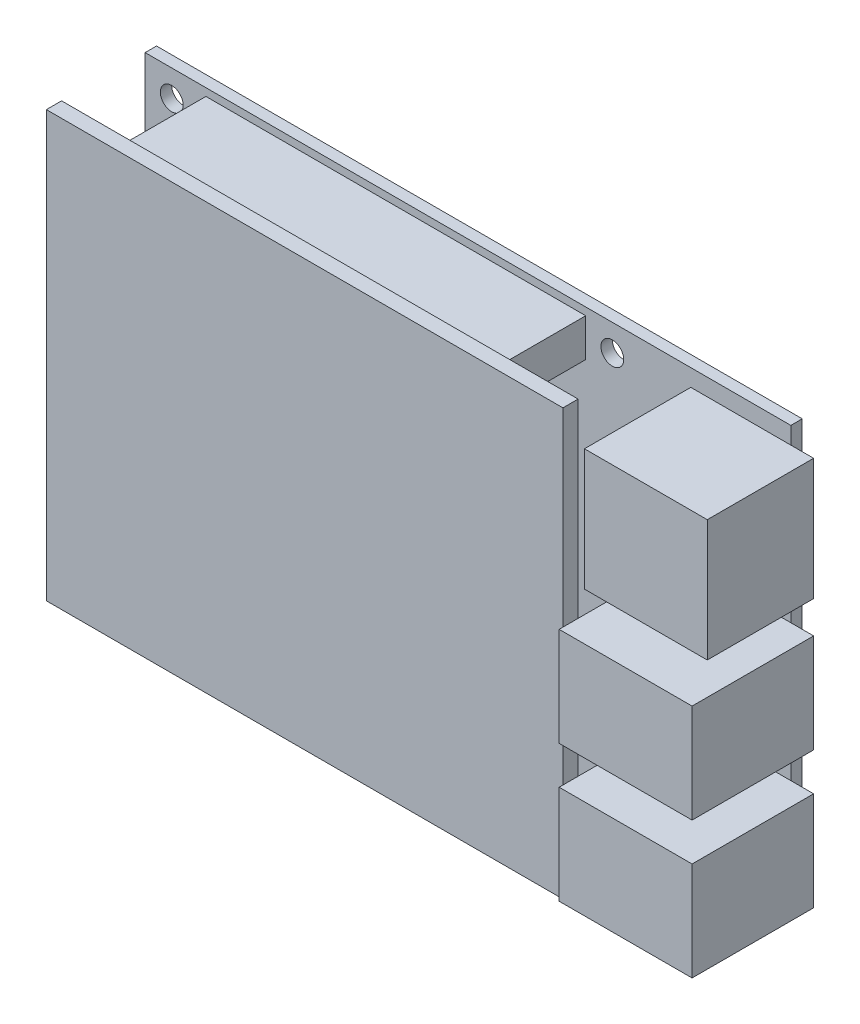
ISO-10303-21;
HEADER;
FILE_DESCRIPTION(('STEP AP214'),'2;1');
FILE_NAME('part.step','',(''),(''),'','','');
FILE_SCHEMA(('AUTOMOTIVE_DESIGN { 1 0 10303 214 1 1 1 1 }'));
ENDSEC;
DATA;
#1=APPLICATION_CONTEXT('core data for automotive mechanical design processes');
#2=APPLICATION_PROTOCOL_DEFINITION('international standard','automotive_design',2000,#1);
#3=PRODUCT_CONTEXT('',#1,'mechanical');
#4=PRODUCT('Part','Part','',(#3));
#5=PRODUCT_RELATED_PRODUCT_CATEGORY('part','',(#4));
#6=PRODUCT_DEFINITION_FORMATION('','',#4);
#7=PRODUCT_DEFINITION_CONTEXT('part definition',#1,'design');
#8=PRODUCT_DEFINITION('design','',#6,#7);
#9=PRODUCT_DEFINITION_SHAPE('','',#8);
#10=(LENGTH_UNIT() NAMED_UNIT(*) SI_UNIT(.MILLI.,.METRE.));
#11=(NAMED_UNIT(*) PLANE_ANGLE_UNIT() SI_UNIT($,.RADIAN.));
#12=(NAMED_UNIT(*) SI_UNIT($,.STERADIAN.) SOLID_ANGLE_UNIT());
#13=UNCERTAINTY_MEASURE_WITH_UNIT(LENGTH_MEASURE(1.E-05),#10,'distance_accuracy_value','');
#14=(GEOMETRIC_REPRESENTATION_CONTEXT(3) GLOBAL_UNCERTAINTY_ASSIGNED_CONTEXT((#13)) GLOBAL_UNIT_ASSIGNED_CONTEXT((#10,
#11,#12)) REPRESENTATION_CONTEXT('',''));
#15=CARTESIAN_POINT('',(0.,0.,0.));
#16=DIRECTION('',(0.,0.,1.));
#17=DIRECTION('',(1.,0.,0.));
#18=AXIS2_PLACEMENT_3D('',#15,#16,#17);
#19=CARTESIAN_POINT('',(0.,0.,1.5));
#20=DIRECTION('',(0.,0.,-1.));
#21=DIRECTION('',(-1.,0.,0.));
#22=AXIS2_PLACEMENT_3D('',#19,#20,#21);
#23=PLANE('',#22);
#24=DIRECTION('',(1.,0.,0.));
#25=VECTOR('',#24,1.);
#26=CARTESIAN_POINT('',(71.8313855418499,37.75,1.5));
#27=LINE('',#26,#25);
#28=CARTESIAN_POINT('',(71.8313855418499,37.75,1.5));
#29=VERTEX_POINT('',#28);
#30=CARTESIAN_POINT('',(85.,37.75,1.5));
#31=VERTEX_POINT('',#30);
#32=EDGE_CURVE('E318',#29,#31,#27,.T.);
#33=ORIENTED_EDGE('',*,*,#32,.F.);
#34=DIRECTION('',(0.,-1.,0.));
#35=VECTOR('',#34,1.);
#36=CARTESIAN_POINT('',(71.8313855418499,53.75,1.5));
#37=LINE('',#36,#35);
#38=CARTESIAN_POINT('',(71.8313855418499,53.75,1.5));
#39=VERTEX_POINT('',#38);
#40=EDGE_CURVE('E298',#39,#29,#37,.T.);
#41=ORIENTED_EDGE('',*,*,#40,.F.);
#42=DIRECTION('',(-1.,0.,0.));
#43=VECTOR('',#42,1.);
#44=CARTESIAN_POINT('',(71.8313855418499,53.75,1.5));
#45=LINE('',#44,#43);
#46=CARTESIAN_POINT('',(85.,53.75,1.5));
#47=VERTEX_POINT('',#46);
#48=EDGE_CURVE('E325',#47,#39,#45,.T.);
#49=ORIENTED_EDGE('',*,*,#48,.F.);
#50=DIRECTION('',(0.,1.,0.));
#51=VECTOR('',#50,1.);
#52=CARTESIAN_POINT('',(85.,0.,1.5));
#53=LINE('',#52,#51);
#54=CARTESIAN_POINT('',(85.,56.,1.5));
#55=VERTEX_POINT('',#54);
#56=EDGE_CURVE('E476',#47,#55,#53,.T.);
#57=ORIENTED_EDGE('',*,*,#56,.T.);
#58=DIRECTION('',(-1.,0.,0.));
#59=VECTOR('',#58,1.);
#60=CARTESIAN_POINT('',(0.,56.,1.5));
#61=LINE('',#60,#59);
#62=CARTESIAN_POINT('',(0.,56.,1.5));
#63=VERTEX_POINT('',#62);
#64=EDGE_CURVE('E481',#55,#63,#61,.T.);
#65=ORIENTED_EDGE('',*,*,#64,.T.);
#66=DIRECTION('',(0.,-1.,0.));
#67=VECTOR('',#66,1.);
#68=CARTESIAN_POINT('',(0.,0.,1.5));
#69=LINE('',#68,#67);
#70=CARTESIAN_POINT('',(0.,0.,1.5));
#71=VERTEX_POINT('',#70);
#72=EDGE_CURVE('E468',#63,#71,#69,.T.);
#73=ORIENTED_EDGE('',*,*,#72,.T.);
#74=DIRECTION('',(1.,0.,0.));
#75=VECTOR('',#74,1.);
#76=CARTESIAN_POINT('',(0.,0.,1.5));
#77=LINE('',#76,#75);
#78=CARTESIAN_POINT('',(85.,0.,1.5));
#79=VERTEX_POINT('',#78);
#80=EDGE_CURVE('E472',#71,#79,#77,.T.);
#81=ORIENTED_EDGE('',*,*,#80,.T.);
#82=CARTESIAN_POINT('',(85.,2.5,1.5));
#83=VERTEX_POINT('',#82);
#84=EDGE_CURVE('E477',#79,#83,#53,.T.);
#85=ORIENTED_EDGE('',*,*,#84,.T.);
#86=DIRECTION('',(1.,0.,0.));
#87=VECTOR('',#86,1.);
#88=CARTESIAN_POINT('',(88.,2.5,1.5));
#89=LINE('',#88,#87);
#90=CARTESIAN_POINT('',(70.5,2.5,1.5));
#91=VERTEX_POINT('',#90);
#92=EDGE_CURVE('E397',#91,#83,#89,.T.);
#93=ORIENTED_EDGE('',*,*,#92,.F.);
#94=DIRECTION('',(0.,-1.,0.));
#95=VECTOR('',#94,1.);
#96=CARTESIAN_POINT('',(70.5,15.5,1.5));
#97=LINE('',#96,#95);
#98=CARTESIAN_POINT('',(70.5,15.5,1.5));
#99=VERTEX_POINT('',#98);
#100=EDGE_CURVE('E412',#99,#91,#97,.T.);
#101=ORIENTED_EDGE('',*,*,#100,.F.);
#102=DIRECTION('',(-1.,0.,0.));
#103=VECTOR('',#102,1.);
#104=CARTESIAN_POINT('',(88.,15.5,1.5));
#105=LINE('',#104,#103);
#106=CARTESIAN_POINT('',(85.,15.5,1.5));
#107=VERTEX_POINT('',#106);
#108=EDGE_CURVE('E11',#107,#99,#105,.T.);
#109=ORIENTED_EDGE('',*,*,#108,.F.);
#110=CARTESIAN_POINT('',(85.,20.5,1.5));
#111=VERTEX_POINT('',#110);
#112=EDGE_CURVE('E545',#107,#111,#53,.T.);
#113=ORIENTED_EDGE('',*,*,#112,.T.);
#114=DIRECTION('',(1.,0.,0.));
#115=VECTOR('',#114,1.);
#116=CARTESIAN_POINT('',(88.,20.5,1.5));
#117=LINE('',#116,#115);
#118=CARTESIAN_POINT('',(70.5,20.5,1.5));
#119=VERTEX_POINT('',#118);
#120=EDGE_CURVE('E350',#119,#111,#117,.T.);
#121=ORIENTED_EDGE('',*,*,#120,.F.);
#122=DIRECTION('',(0.,-1.,0.));
#123=VECTOR('',#122,1.);
#124=CARTESIAN_POINT('',(70.5,33.5,1.5));
#125=LINE('',#124,#123);
#126=CARTESIAN_POINT('',(70.5,33.5,1.5));
#127=VERTEX_POINT('',#126);
#128=EDGE_CURVE('E368',#127,#119,#125,.T.);
#129=ORIENTED_EDGE('',*,*,#128,.F.);
#130=DIRECTION('',(-1.,0.,0.));
#131=VECTOR('',#130,1.);
#132=CARTESIAN_POINT('',(88.,33.5,1.5));
#133=LINE('',#132,#131);
#134=CARTESIAN_POINT('',(85.,33.5,1.5));
#135=VERTEX_POINT('',#134);
#136=EDGE_CURVE('E363',#135,#127,#133,.T.);
#137=ORIENTED_EDGE('',*,*,#136,.F.);
#138=EDGE_CURVE('E535',#135,#31,#53,.T.);
#139=ORIENTED_EDGE('',*,*,#138,.T.);
#140=EDGE_LOOP('',(#33,#41,#49,#57,#65,#73,#81,#85,#93,#101,#109,#113,#121,#129,#137,#139));
#141=FACE_BOUND('',#140,.T.);
#142=CARTESIAN_POINT('',(3.5,3.5,1.5));
#143=DIRECTION('',(0.,0.,1.));
#144=DIRECTION('',(1.,0.,0.));
#145=AXIS2_PLACEMENT_3D('',#142,#143,#144);
#146=CIRCLE('',#145,1.5);
#147=CARTESIAN_POINT('',(5.,3.5,1.5));
#148=VERTEX_POINT('',#147);
#149=EDGE_CURVE('E449',#148,#148,#146,.T.);
#150=ORIENTED_EDGE('',*,*,#149,.F.);
#151=EDGE_LOOP('',(#150));
#152=FACE_BOUND('',#151,.T.);
#153=CARTESIAN_POINT('',(61.5,52.5,1.5));
#154=DIRECTION('',(0.,0.,1.));
#155=DIRECTION('',(1.,0.,0.));
#156=AXIS2_PLACEMENT_3D('',#153,#154,#155);
#157=CIRCLE('',#156,1.49999999999999);
#158=CARTESIAN_POINT('',(63.,52.5,1.5));
#159=VERTEX_POINT('',#158);
#160=EDGE_CURVE('E440',#159,#159,#157,.T.);
#161=ORIENTED_EDGE('',*,*,#160,.F.);
#162=EDGE_LOOP('',(#161));
#163=FACE_BOUND('',#162,.T.);
#164=CARTESIAN_POINT('',(61.5,3.5,1.5));
#165=DIRECTION('',(0.,0.,1.));
#166=DIRECTION('',(1.,0.,0.));
#167=AXIS2_PLACEMENT_3D('',#164,#165,#166);
#168=CIRCLE('',#167,1.5);
#169=CARTESIAN_POINT('',(63.,3.5,1.5));
#170=VERTEX_POINT('',#169);
#171=EDGE_CURVE('E435',#170,#170,#168,.T.);
#172=ORIENTED_EDGE('',*,*,#171,.F.);
#173=EDGE_LOOP('',(#172));
#174=FACE_BOUND('',#173,.T.);
#175=CARTESIAN_POINT('',(3.5,52.5,1.5));
#176=DIRECTION('',(0.,0.,1.));
#177=DIRECTION('',(1.,0.,0.));
#178=AXIS2_PLACEMENT_3D('',#175,#176,#177);
#179=CIRCLE('',#178,1.5);
#180=CARTESIAN_POINT('',(5.,52.5,1.5));
#181=VERTEX_POINT('',#180);
#182=EDGE_CURVE('E448',#181,#181,#179,.T.);
#183=ORIENTED_EDGE('',*,*,#182,.F.);
#184=EDGE_LOOP('',(#183));
#185=FACE_BOUND('',#184,.T.);
#186=DIRECTION('',(0.,-1.,0.));
#187=VECTOR('',#186,1.);
#188=CARTESIAN_POINT('',(8.,55.,1.5));
#189=LINE('',#188,#187);
#190=CARTESIAN_POINT('',(8.,55.,1.5));
#191=VERTEX_POINT('',#190);
#192=CARTESIAN_POINT('',(8.,50.,1.5));
#193=VERTEX_POINT('',#192);
#194=EDGE_CURVE('E249',#191,#193,#189,.T.);
#195=ORIENTED_EDGE('',*,*,#194,.F.);
#196=DIRECTION('',(-1.,0.,0.));
#197=VECTOR('',#196,1.);
#198=CARTESIAN_POINT('',(8.,55.,1.5));
#199=LINE('',#198,#197);
#200=CARTESIAN_POINT('',(58.,55.,1.5));
#201=VERTEX_POINT('',#200);
#202=EDGE_CURVE('E264',#201,#191,#199,.T.);
#203=ORIENTED_EDGE('',*,*,#202,.F.);
#204=DIRECTION('',(0.,1.,0.));
#205=VECTOR('',#204,1.);
#206=CARTESIAN_POINT('',(58.,55.,1.5));
#207=LINE('',#206,#205);
#208=CARTESIAN_POINT('',(58.,50.,1.5));
#209=VERTEX_POINT('',#208);
#210=EDGE_CURVE('E64',#209,#201,#207,.T.);
#211=ORIENTED_EDGE('',*,*,#210,.F.);
#212=DIRECTION('',(1.,0.,0.));
#213=VECTOR('',#212,1.);
#214=CARTESIAN_POINT('',(8.,50.,1.5));
#215=LINE('',#214,#213);
#216=EDGE_CURVE('E59',#193,#209,#215,.T.);
#217=ORIENTED_EDGE('',*,*,#216,.F.);
#218=EDGE_LOOP('',(#195,#203,#211,#217));
#219=FACE_BOUND('',#218,.T.);
#220=ADVANCED_FACE('F41',(#141,#152,#163,#174,#185,#219),#23,.F.);
#221=CARTESIAN_POINT('',(0.,0.,1.5));
#222=DIRECTION('',(1.,0.,0.));
#223=DIRECTION('',(0.,0.,-1.));
#224=AXIS2_PLACEMENT_3D('',#221,#222,#223);
#225=PLANE('',#224);
#226=DIRECTION('',(0.,-1.,0.));
#227=VECTOR('',#226,1.);
#228=CARTESIAN_POINT('',(0.,0.,0.));
#229=LINE('',#228,#227);
#230=CARTESIAN_POINT('',(0.,56.,0.));
#231=VERTEX_POINT('',#230);
#232=CARTESIAN_POINT('',(0.,0.,0.));
#233=VERTEX_POINT('',#232);
#234=EDGE_CURVE('E464',#231,#233,#229,.T.);
#235=ORIENTED_EDGE('',*,*,#234,.T.);
#236=DIRECTION('',(0.,0.,-1.));
#237=VECTOR('',#236,1.);
#238=CARTESIAN_POINT('',(0.,0.,1.5));
#239=LINE('',#238,#237);
#240=EDGE_CURVE('E45',#71,#233,#239,.T.);
#241=ORIENTED_EDGE('',*,*,#240,.F.);
#242=ORIENTED_EDGE('',*,*,#72,.F.);
#243=DIRECTION('',(0.,0.,-1.));
#244=VECTOR('',#243,1.);
#245=CARTESIAN_POINT('',(0.,56.,1.5));
#246=LINE('',#245,#244);
#247=EDGE_CURVE('E485',#63,#231,#246,.T.);
#248=ORIENTED_EDGE('',*,*,#247,.T.);
#249=EDGE_LOOP('',(#235,#241,#242,#248));
#250=FACE_BOUND('',#249,.T.);
#251=ADVANCED_FACE('F43',(#250),#225,.F.);
#252=CARTESIAN_POINT('',(0.,0.,1.5));
#253=DIRECTION('',(0.,1.,0.));
#254=DIRECTION('',(0.,0.,1.));
#255=AXIS2_PLACEMENT_3D('',#252,#253,#254);
#256=PLANE('',#255);
#257=DIRECTION('',(1.,0.,0.));
#258=VECTOR('',#257,1.);
#259=CARTESIAN_POINT('',(0.,0.,0.));
#260=LINE('',#259,#258);
#261=CARTESIAN_POINT('',(85.,0.,0.));
#262=VERTEX_POINT('',#261);
#263=EDGE_CURVE('E489',#233,#262,#260,.T.);
#264=ORIENTED_EDGE('',*,*,#263,.T.);
#265=DIRECTION('',(0.,0.,-1.));
#266=VECTOR('',#265,1.);
#267=CARTESIAN_POINT('',(85.,0.,1.5));
#268=LINE('',#267,#266);
#269=EDGE_CURVE('E503',#79,#262,#268,.T.);
#270=ORIENTED_EDGE('',*,*,#269,.F.);
#271=ORIENTED_EDGE('',*,*,#80,.F.);
#272=ORIENTED_EDGE('',*,*,#240,.T.);
#273=EDGE_LOOP('',(#264,#270,#271,#272));
#274=FACE_BOUND('',#273,.T.);
#275=ADVANCED_FACE('F514',(#274),#256,.F.);
#276=CARTESIAN_POINT('',(85.,0.,1.5));
#277=DIRECTION('',(-1.,0.,0.));
#278=DIRECTION('',(0.,0.,1.));
#279=AXIS2_PLACEMENT_3D('',#276,#277,#278);
#280=PLANE('',#279);
#281=DIRECTION('',(0.,1.,0.));
#282=VECTOR('',#281,1.);
#283=CARTESIAN_POINT('',(85.,0.,0.));
#284=LINE('',#283,#282);
#285=CARTESIAN_POINT('',(85.,56.,0.));
#286=VERTEX_POINT('',#285);
#287=EDGE_CURVE('E492',#262,#286,#284,.T.);
#288=ORIENTED_EDGE('',*,*,#287,.T.);
#289=DIRECTION('',(0.,0.,-1.));
#290=VECTOR('',#289,1.);
#291=CARTESIAN_POINT('',(85.,56.,1.5));
#292=LINE('',#291,#290);
#293=EDGE_CURVE('E500',#55,#286,#292,.T.);
#294=ORIENTED_EDGE('',*,*,#293,.F.);
#295=ORIENTED_EDGE('',*,*,#56,.F.);
#296=EDGE_CURVE('E533',#31,#47,#53,.T.);
#297=ORIENTED_EDGE('',*,*,#296,.F.);
#298=ORIENTED_EDGE('',*,*,#138,.F.);
#299=EDGE_CURVE('E541',#111,#135,#53,.T.);
#300=ORIENTED_EDGE('',*,*,#299,.F.);
#301=ORIENTED_EDGE('',*,*,#112,.F.);
#302=EDGE_CURVE('E482',#83,#107,#53,.T.);
#303=ORIENTED_EDGE('',*,*,#302,.F.);
#304=ORIENTED_EDGE('',*,*,#84,.F.);
#305=ORIENTED_EDGE('',*,*,#269,.T.);
#306=EDGE_LOOP('',(#288,#294,#295,#297,#298,#300,#301,#303,#304,#305));
#307=FACE_BOUND('',#306,.T.);
#308=ADVANCED_FACE('F523',(#307),#280,.F.);
#309=CARTESIAN_POINT('',(0.,56.,1.5));
#310=DIRECTION('',(0.,-1.,0.));
#311=DIRECTION('',(0.,0.,-1.));
#312=AXIS2_PLACEMENT_3D('',#309,#310,#311);
#313=PLANE('',#312);
#314=DIRECTION('',(-1.,0.,0.));
#315=VECTOR('',#314,1.);
#316=CARTESIAN_POINT('',(0.,56.,0.));
#317=LINE('',#316,#315);
#318=EDGE_CURVE('E473',#286,#231,#317,.T.);
#319=ORIENTED_EDGE('',*,*,#318,.T.);
#320=ORIENTED_EDGE('',*,*,#247,.F.);
#321=ORIENTED_EDGE('',*,*,#64,.F.);
#322=ORIENTED_EDGE('',*,*,#293,.T.);
#323=EDGE_LOOP('',(#319,#320,#321,#322));
#324=FACE_BOUND('',#323,.T.);
#325=ADVANCED_FACE('F526',(#324),#313,.F.);
#326=CARTESIAN_POINT('',(0.,0.,0.));
#327=DIRECTION('',(0.,0.,-1.));
#328=DIRECTION('',(-1.,0.,0.));
#329=AXIS2_PLACEMENT_3D('',#326,#327,#328);
#330=PLANE('',#329);
#331=CARTESIAN_POINT('',(3.5,3.5,0.));
#332=DIRECTION('',(0.,0.,1.));
#333=DIRECTION('',(1.,0.,0.));
#334=AXIS2_PLACEMENT_3D('',#331,#332,#333);
#335=CIRCLE('',#334,1.5);
#336=CARTESIAN_POINT('',(5.,3.5,0.));
#337=VERTEX_POINT('',#336);
#338=EDGE_CURVE('E444',#337,#337,#335,.T.);
#339=ORIENTED_EDGE('',*,*,#338,.T.);
#340=EDGE_LOOP('',(#339));
#341=FACE_BOUND('',#340,.T.);
#342=CARTESIAN_POINT('',(61.5,52.5,0.));
#343=DIRECTION('',(0.,0.,1.));
#344=DIRECTION('',(1.,0.,0.));
#345=AXIS2_PLACEMENT_3D('',#342,#343,#344);
#346=CIRCLE('',#345,1.49999999999999);
#347=CARTESIAN_POINT('',(63.,52.5,0.));
#348=VERTEX_POINT('',#347);
#349=EDGE_CURVE('E453',#348,#348,#346,.T.);
#350=ORIENTED_EDGE('',*,*,#349,.T.);
#351=EDGE_LOOP('',(#350));
#352=FACE_BOUND('',#351,.T.);
#353=CARTESIAN_POINT('',(61.5,3.5,0.));
#354=DIRECTION('',(0.,0.,1.));
#355=DIRECTION('',(1.,0.,0.));
#356=AXIS2_PLACEMENT_3D('',#353,#354,#355);
#357=CIRCLE('',#356,1.5);
#358=CARTESIAN_POINT('',(63.,3.5,0.));
#359=VERTEX_POINT('',#358);
#360=EDGE_CURVE('E436',#359,#359,#357,.T.);
#361=ORIENTED_EDGE('',*,*,#360,.T.);
#362=EDGE_LOOP('',(#361));
#363=FACE_BOUND('',#362,.T.);
#364=CARTESIAN_POINT('',(3.5,52.5,0.));
#365=DIRECTION('',(0.,0.,1.));
#366=DIRECTION('',(1.,0.,0.));
#367=AXIS2_PLACEMENT_3D('',#364,#365,#366);
#368=CIRCLE('',#367,1.5);
#369=CARTESIAN_POINT('',(5.,52.5,0.));
#370=VERTEX_POINT('',#369);
#371=EDGE_CURVE('E460',#370,#370,#368,.T.);
#372=ORIENTED_EDGE('',*,*,#371,.T.);
#373=EDGE_LOOP('',(#372));
#374=FACE_BOUND('',#373,.T.);
#375=ORIENTED_EDGE('',*,*,#234,.F.);
#376=ORIENTED_EDGE('',*,*,#318,.F.);
#377=ORIENTED_EDGE('',*,*,#287,.F.);
#378=ORIENTED_EDGE('',*,*,#263,.F.);
#379=EDGE_LOOP('',(#375,#376,#377,#378));
#380=FACE_BOUND('',#379,.T.);
#381=ADVANCED_FACE('F521',(#341,#352,#363,#374,#380),#330,.T.);
#382=CARTESIAN_POINT('',(3.5,52.5,0.));
#383=DIRECTION('',(0.,0.,1.));
#384=DIRECTION('',(1.,0.,0.));
#385=AXIS2_PLACEMENT_3D('',#382,#383,#384);
#386=CYLINDRICAL_SURFACE('',#385,1.5);
#387=ORIENTED_EDGE('',*,*,#371,.F.);
#388=EDGE_LOOP('',(#387));
#389=FACE_BOUND('',#388,.T.);
#390=ORIENTED_EDGE('',*,*,#182,.T.);
#391=EDGE_LOOP('',(#390));
#392=FACE_BOUND('',#391,.T.);
#393=ADVANCED_FACE('F610',(#389,#392),#386,.F.);
#394=CARTESIAN_POINT('',(61.5,3.5,0.));
#395=DIRECTION('',(0.,0.,1.));
#396=DIRECTION('',(1.,0.,0.));
#397=AXIS2_PLACEMENT_3D('',#394,#395,#396);
#398=CYLINDRICAL_SURFACE('',#397,1.5);
#399=ORIENTED_EDGE('',*,*,#360,.F.);
#400=EDGE_LOOP('',(#399));
#401=FACE_BOUND('',#400,.T.);
#402=ORIENTED_EDGE('',*,*,#171,.T.);
#403=EDGE_LOOP('',(#402));
#404=FACE_BOUND('',#403,.T.);
#405=ADVANCED_FACE('F643',(#401,#404),#398,.F.);
#406=CARTESIAN_POINT('',(61.5,52.5,0.));
#407=DIRECTION('',(0.,0.,1.));
#408=DIRECTION('',(1.,0.,0.));
#409=AXIS2_PLACEMENT_3D('',#406,#407,#408);
#410=CYLINDRICAL_SURFACE('',#409,1.49999999999999);
#411=ORIENTED_EDGE('',*,*,#349,.F.);
#412=EDGE_LOOP('',(#411));
#413=FACE_BOUND('',#412,.T.);
#414=ORIENTED_EDGE('',*,*,#160,.T.);
#415=EDGE_LOOP('',(#414));
#416=FACE_BOUND('',#415,.T.);
#417=ADVANCED_FACE('F650',(#413,#416),#410,.F.);
#418=CARTESIAN_POINT('',(3.5,3.5,0.));
#419=DIRECTION('',(0.,0.,1.));
#420=DIRECTION('',(1.,0.,0.));
#421=AXIS2_PLACEMENT_3D('',#418,#419,#420);
#422=CYLINDRICAL_SURFACE('',#421,1.5);
#423=ORIENTED_EDGE('',*,*,#338,.F.);
#424=EDGE_LOOP('',(#423));
#425=FACE_BOUND('',#424,.T.);
#426=ORIENTED_EDGE('',*,*,#149,.T.);
#427=EDGE_LOOP('',(#426));
#428=FACE_BOUND('',#427,.T.);
#429=ADVANCED_FACE('F658',(#425,#428),#422,.F.);
#430=CARTESIAN_POINT('',(88.,15.5,17.5));
#431=DIRECTION('',(-1.,0.,0.));
#432=DIRECTION('',(0.,0.,1.));
#433=AXIS2_PLACEMENT_3D('',#430,#431,#432);
#434=PLANE('',#433);
#435=DIRECTION('',(0.,1.,0.));
#436=VECTOR('',#435,1.);
#437=CARTESIAN_POINT('',(88.,15.5,1.5));
#438=LINE('',#437,#436);
#439=CARTESIAN_POINT('',(88.,2.5,1.5));
#440=VERTEX_POINT('',#439);
#441=CARTESIAN_POINT('',(88.,15.5,1.5));
#442=VERTEX_POINT('',#441);
#443=EDGE_CURVE('E391',#440,#442,#438,.T.);
#444=ORIENTED_EDGE('',*,*,#443,.T.);
#445=DIRECTION('',(0.,0.,-1.));
#446=VECTOR('',#445,1.);
#447=CARTESIAN_POINT('',(88.,15.5,17.5));
#448=LINE('',#447,#446);
#449=CARTESIAN_POINT('',(88.,15.5,17.5));
#450=VERTEX_POINT('',#449);
#451=EDGE_CURVE('E431',#450,#442,#448,.T.);
#452=ORIENTED_EDGE('',*,*,#451,.F.);
#453=DIRECTION('',(0.,1.,0.));
#454=VECTOR('',#453,1.);
#455=CARTESIAN_POINT('',(88.,15.5,17.5));
#456=LINE('',#455,#454);
#457=CARTESIAN_POINT('',(88.,2.5,17.5));
#458=VERTEX_POINT('',#457);
#459=EDGE_CURVE('E392',#458,#450,#456,.T.);
#460=ORIENTED_EDGE('',*,*,#459,.F.);
#461=DIRECTION('',(0.,0.,-1.));
#462=VECTOR('',#461,1.);
#463=CARTESIAN_POINT('',(88.,2.5,17.5));
#464=LINE('',#463,#462);
#465=EDGE_CURVE('E406',#458,#440,#464,.T.);
#466=ORIENTED_EDGE('',*,*,#465,.T.);
#467=EDGE_LOOP('',(#444,#452,#460,#466));
#468=FACE_BOUND('',#467,.T.);
#469=ADVANCED_FACE('F563',(#468),#434,.F.);
#470=CARTESIAN_POINT('',(88.,15.5,17.5));
#471=DIRECTION('',(0.,-1.,0.));
#472=DIRECTION('',(0.,0.,-1.));
#473=AXIS2_PLACEMENT_3D('',#470,#471,#472);
#474=PLANE('',#473);
#475=EDGE_CURVE('E52',#442,#107,#105,.T.);
#476=ORIENTED_EDGE('',*,*,#475,.T.);
#477=ORIENTED_EDGE('',*,*,#108,.T.);
#478=DIRECTION('',(0.,0.,-1.));
#479=VECTOR('',#478,1.);
#480=CARTESIAN_POINT('',(70.5,15.5,17.5));
#481=LINE('',#480,#479);
#482=CARTESIAN_POINT('',(70.5,15.5,17.5));
#483=VERTEX_POINT('',#482);
#484=EDGE_CURVE('E427',#483,#99,#481,.T.);
#485=ORIENTED_EDGE('',*,*,#484,.F.);
#486=DIRECTION('',(-1.,0.,0.));
#487=VECTOR('',#486,1.);
#488=CARTESIAN_POINT('',(88.,15.5,17.5));
#489=LINE('',#488,#487);
#490=EDGE_CURVE('E396',#450,#483,#489,.T.);
#491=ORIENTED_EDGE('',*,*,#490,.F.);
#492=ORIENTED_EDGE('',*,*,#451,.T.);
#493=EDGE_LOOP('',(#476,#477,#485,#491,#492));
#494=FACE_BOUND('',#493,.T.);
#495=ADVANCED_FACE('F558',(#494),#474,.F.);
#496=CARTESIAN_POINT('',(70.5,15.5,17.5));
#497=DIRECTION('',(1.,0.,0.));
#498=DIRECTION('',(0.,0.,-1.));
#499=AXIS2_PLACEMENT_3D('',#496,#497,#498);
#500=PLANE('',#499);
#501=ORIENTED_EDGE('',*,*,#100,.T.);
#502=DIRECTION('',(0.,0.,-1.));
#503=VECTOR('',#502,1.);
#504=CARTESIAN_POINT('',(70.5,2.5,17.5));
#505=LINE('',#504,#503);
#506=CARTESIAN_POINT('',(70.5,2.5,17.5));
#507=VERTEX_POINT('',#506);
#508=EDGE_CURVE('E423',#507,#91,#505,.T.);
#509=ORIENTED_EDGE('',*,*,#508,.F.);
#510=DIRECTION('',(0.,-1.,0.));
#511=VECTOR('',#510,1.);
#512=CARTESIAN_POINT('',(70.5,15.5,17.5));
#513=LINE('',#512,#511);
#514=EDGE_CURVE('E400',#483,#507,#513,.T.);
#515=ORIENTED_EDGE('',*,*,#514,.F.);
#516=ORIENTED_EDGE('',*,*,#484,.T.);
#517=EDGE_LOOP('',(#501,#509,#515,#516));
#518=FACE_BOUND('',#517,.T.);
#519=ADVANCED_FACE('F678',(#518),#500,.F.);
#520=CARTESIAN_POINT('',(88.,2.5,17.5));
#521=DIRECTION('',(0.,1.,0.));
#522=DIRECTION('',(-1.,0.,0.));
#523=AXIS2_PLACEMENT_3D('',#520,#521,#522);
#524=PLANE('',#523);
#525=ORIENTED_EDGE('',*,*,#92,.T.);
#526=EDGE_CURVE('E416',#83,#440,#89,.T.);
#527=ORIENTED_EDGE('',*,*,#526,.T.);
#528=ORIENTED_EDGE('',*,*,#465,.F.);
#529=DIRECTION('',(1.,0.,0.));
#530=VECTOR('',#529,1.);
#531=CARTESIAN_POINT('',(88.,2.5,17.5));
#532=LINE('',#531,#530);
#533=EDGE_CURVE('E403',#507,#458,#532,.T.);
#534=ORIENTED_EDGE('',*,*,#533,.F.);
#535=ORIENTED_EDGE('',*,*,#508,.T.);
#536=EDGE_LOOP('',(#525,#527,#528,#534,#535));
#537=FACE_BOUND('',#536,.T.);
#538=ADVANCED_FACE('F567',(#537),#524,.F.);
#539=CARTESIAN_POINT('',(0.,0.,17.5));
#540=DIRECTION('',(0.,0.,-1.));
#541=DIRECTION('',(-1.,0.,0.));
#542=AXIS2_PLACEMENT_3D('',#539,#540,#541);
#543=PLANE('',#542);
#544=ORIENTED_EDGE('',*,*,#459,.T.);
#545=ORIENTED_EDGE('',*,*,#490,.T.);
#546=ORIENTED_EDGE('',*,*,#514,.T.);
#547=ORIENTED_EDGE('',*,*,#533,.T.);
#548=EDGE_LOOP('',(#544,#545,#546,#547));
#549=FACE_BOUND('',#548,.T.);
#550=ADVANCED_FACE('F692',(#549),#543,.F.);
#551=CARTESIAN_POINT('',(0.,0.,1.5));
#552=DIRECTION('',(0.,0.,-1.));
#553=DIRECTION('',(-1.,0.,0.));
#554=AXIS2_PLACEMENT_3D('',#551,#552,#553);
#555=PLANE('',#554);
#556=ORIENTED_EDGE('',*,*,#526,.F.);
#557=ORIENTED_EDGE('',*,*,#302,.T.);
#558=ORIENTED_EDGE('',*,*,#475,.F.);
#559=ORIENTED_EDGE('',*,*,#443,.F.);
#560=EDGE_LOOP('',(#556,#557,#558,#559));
#561=FACE_BOUND('',#560,.T.);
#562=ADVANCED_FACE('F555',(#561),#555,.T.);
#563=CARTESIAN_POINT('',(0.,0.,1.5));
#564=DIRECTION('',(0.,0.,-1.));
#565=DIRECTION('',(-1.,0.,0.));
#566=AXIS2_PLACEMENT_3D('',#563,#564,#565);
#567=PLANE('',#566);
#568=ORIENTED_EDGE('',*,*,#299,.T.);
#569=CARTESIAN_POINT('',(88.,33.5,1.5));
#570=VERTEX_POINT('',#569);
#571=EDGE_CURVE('E364',#570,#135,#133,.T.);
#572=ORIENTED_EDGE('',*,*,#571,.F.);
#573=DIRECTION('',(0.,1.,0.));
#574=VECTOR('',#573,1.);
#575=CARTESIAN_POINT('',(88.,33.5,1.5));
#576=LINE('',#575,#574);
#577=CARTESIAN_POINT('',(88.,20.5,1.5));
#578=VERTEX_POINT('',#577);
#579=EDGE_CURVE('E344',#578,#570,#576,.T.);
#580=ORIENTED_EDGE('',*,*,#579,.F.);
#581=EDGE_CURVE('E372',#111,#578,#117,.T.);
#582=ORIENTED_EDGE('',*,*,#581,.F.);
#583=EDGE_LOOP('',(#568,#572,#580,#582));
#584=FACE_BOUND('',#583,.T.);
#585=ADVANCED_FACE('F706',(#584),#567,.T.);
#586=CARTESIAN_POINT('',(88.,33.5,17.5));
#587=DIRECTION('',(-1.,0.,0.));
#588=DIRECTION('',(0.,0.,1.));
#589=AXIS2_PLACEMENT_3D('',#586,#587,#588);
#590=PLANE('',#589);
#591=ORIENTED_EDGE('',*,*,#579,.T.);
#592=DIRECTION('',(0.,0.,-1.));
#593=VECTOR('',#592,1.);
#594=CARTESIAN_POINT('',(88.,33.5,17.5));
#595=LINE('',#594,#593);
#596=CARTESIAN_POINT('',(88.,33.5,17.5));
#597=VERTEX_POINT('',#596);
#598=EDGE_CURVE('E387',#597,#570,#595,.T.);
#599=ORIENTED_EDGE('',*,*,#598,.F.);
#600=DIRECTION('',(0.,1.,0.));
#601=VECTOR('',#600,1.);
#602=CARTESIAN_POINT('',(88.,33.5,17.5));
#603=LINE('',#602,#601);
#604=CARTESIAN_POINT('',(88.,20.5,17.5));
#605=VERTEX_POINT('',#604);
#606=EDGE_CURVE('E345',#605,#597,#603,.T.);
#607=ORIENTED_EDGE('',*,*,#606,.F.);
#608=DIRECTION('',(0.,0.,-1.));
#609=VECTOR('',#608,1.);
#610=CARTESIAN_POINT('',(88.,20.5,17.5));
#611=LINE('',#610,#609);
#612=EDGE_CURVE('E359',#605,#578,#611,.T.);
#613=ORIENTED_EDGE('',*,*,#612,.T.);
#614=EDGE_LOOP('',(#591,#599,#607,#613));
#615=FACE_BOUND('',#614,.T.);
#616=ADVANCED_FACE('F713',(#615),#590,.F.);
#617=CARTESIAN_POINT('',(88.,33.5,17.5));
#618=DIRECTION('',(0.,-1.,0.));
#619=DIRECTION('',(0.,0.,-1.));
#620=AXIS2_PLACEMENT_3D('',#617,#618,#619);
#621=PLANE('',#620);
#622=ORIENTED_EDGE('',*,*,#571,.T.);
#623=ORIENTED_EDGE('',*,*,#136,.T.);
#624=DIRECTION('',(0.,0.,-1.));
#625=VECTOR('',#624,1.);
#626=CARTESIAN_POINT('',(70.5,33.5,17.5));
#627=LINE('',#626,#625);
#628=CARTESIAN_POINT('',(70.5,33.5,17.5));
#629=VERTEX_POINT('',#628);
#630=EDGE_CURVE('E383',#629,#127,#627,.T.);
#631=ORIENTED_EDGE('',*,*,#630,.F.);
#632=DIRECTION('',(-1.,0.,0.));
#633=VECTOR('',#632,1.);
#634=CARTESIAN_POINT('',(88.,33.5,17.5));
#635=LINE('',#634,#633);
#636=EDGE_CURVE('E349',#597,#629,#635,.T.);
#637=ORIENTED_EDGE('',*,*,#636,.F.);
#638=ORIENTED_EDGE('',*,*,#598,.T.);
#639=EDGE_LOOP('',(#622,#623,#631,#637,#638));
#640=FACE_BOUND('',#639,.T.);
#641=ADVANCED_FACE('F720',(#640),#621,.F.);
#642=CARTESIAN_POINT('',(70.5,33.5,17.5));
#643=DIRECTION('',(1.,0.,0.));
#644=DIRECTION('',(0.,0.,-1.));
#645=AXIS2_PLACEMENT_3D('',#642,#643,#644);
#646=PLANE('',#645);
#647=ORIENTED_EDGE('',*,*,#128,.T.);
#648=DIRECTION('',(0.,0.,-1.));
#649=VECTOR('',#648,1.);
#650=CARTESIAN_POINT('',(70.5,20.5,17.5));
#651=LINE('',#650,#649);
#652=CARTESIAN_POINT('',(70.5,20.5,17.5));
#653=VERTEX_POINT('',#652);
#654=EDGE_CURVE('E379',#653,#119,#651,.T.);
#655=ORIENTED_EDGE('',*,*,#654,.F.);
#656=DIRECTION('',(0.,-1.,0.));
#657=VECTOR('',#656,1.);
#658=CARTESIAN_POINT('',(70.5,33.5,17.5));
#659=LINE('',#658,#657);
#660=EDGE_CURVE('E353',#629,#653,#659,.T.);
#661=ORIENTED_EDGE('',*,*,#660,.F.);
#662=ORIENTED_EDGE('',*,*,#630,.T.);
#663=EDGE_LOOP('',(#647,#655,#661,#662));
#664=FACE_BOUND('',#663,.T.);
#665=ADVANCED_FACE('F728',(#664),#646,.F.);
#666=CARTESIAN_POINT('',(88.,20.5,17.5));
#667=DIRECTION('',(0.,1.,0.));
#668=DIRECTION('',(-1.,0.,0.));
#669=AXIS2_PLACEMENT_3D('',#666,#667,#668);
#670=PLANE('',#669);
#671=ORIENTED_EDGE('',*,*,#120,.T.);
#672=ORIENTED_EDGE('',*,*,#581,.T.);
#673=ORIENTED_EDGE('',*,*,#612,.F.);
#674=DIRECTION('',(1.,0.,0.));
#675=VECTOR('',#674,1.);
#676=CARTESIAN_POINT('',(88.,20.5,17.5));
#677=LINE('',#676,#675);
#678=EDGE_CURVE('E356',#653,#605,#677,.T.);
#679=ORIENTED_EDGE('',*,*,#678,.F.);
#680=ORIENTED_EDGE('',*,*,#654,.T.);
#681=EDGE_LOOP('',(#671,#672,#673,#679,#680));
#682=FACE_BOUND('',#681,.T.);
#683=ADVANCED_FACE('F736',(#682),#670,.F.);
#684=CARTESIAN_POINT('',(0.,0.,17.5));
#685=DIRECTION('',(0.,0.,-1.));
#686=DIRECTION('',(-1.,0.,0.));
#687=AXIS2_PLACEMENT_3D('',#684,#685,#686);
#688=PLANE('',#687);
#689=ORIENTED_EDGE('',*,*,#606,.T.);
#690=ORIENTED_EDGE('',*,*,#636,.T.);
#691=ORIENTED_EDGE('',*,*,#660,.T.);
#692=ORIENTED_EDGE('',*,*,#678,.T.);
#693=EDGE_LOOP('',(#689,#690,#691,#692));
#694=FACE_BOUND('',#693,.T.);
#695=ADVANCED_FACE('F600',(#694),#688,.F.);
#696=CARTESIAN_POINT('',(0.,0.,1.5));
#697=DIRECTION('',(0.,0.,1.));
#698=DIRECTION('',(1.,0.,0.));
#699=AXIS2_PLACEMENT_3D('',#696,#697,#698);
#700=PLANE('',#699);
#701=CARTESIAN_POINT('',(88.,37.75,1.5));
#702=VERTEX_POINT('',#701);
#703=EDGE_CURVE('E317',#31,#702,#27,.T.);
#704=ORIENTED_EDGE('',*,*,#703,.F.);
#705=ORIENTED_EDGE('',*,*,#296,.T.);
#706=CARTESIAN_POINT('',(88.,53.75,1.5));
#707=VERTEX_POINT('',#706);
#708=EDGE_CURVE('E304',#707,#47,#45,.T.);
#709=ORIENTED_EDGE('',*,*,#708,.F.);
#710=DIRECTION('',(0.,1.,0.));
#711=VECTOR('',#710,1.);
#712=CARTESIAN_POINT('',(88.,53.75,1.5));
#713=LINE('',#712,#711);
#714=EDGE_CURVE('E322',#702,#707,#713,.T.);
#715=ORIENTED_EDGE('',*,*,#714,.F.);
#716=EDGE_LOOP('',(#704,#705,#709,#715));
#717=FACE_BOUND('',#716,.T.);
#718=ADVANCED_FACE('F582',(#717),#700,.F.);
#719=CARTESIAN_POINT('',(71.8313855418499,53.75,15.5));
#720=DIRECTION('',(1.,0.,0.));
#721=DIRECTION('',(0.,0.,-1.));
#722=AXIS2_PLACEMENT_3D('',#719,#720,#721);
#723=PLANE('',#722);
#724=ORIENTED_EDGE('',*,*,#40,.T.);
#725=DIRECTION('',(0.,0.,-1.));
#726=VECTOR('',#725,1.);
#727=CARTESIAN_POINT('',(71.8313855418499,37.75,15.5));
#728=LINE('',#727,#726);
#729=CARTESIAN_POINT('',(71.8313855418499,37.75,15.5));
#730=VERTEX_POINT('',#729);
#731=EDGE_CURVE('E340',#730,#29,#728,.T.);
#732=ORIENTED_EDGE('',*,*,#731,.F.);
#733=DIRECTION('',(0.,-1.,0.));
#734=VECTOR('',#733,1.);
#735=CARTESIAN_POINT('',(71.8313855418499,53.75,15.5));
#736=LINE('',#735,#734);
#737=CARTESIAN_POINT('',(71.8313855418499,53.75,15.5));
#738=VERTEX_POINT('',#737);
#739=EDGE_CURVE('E299',#738,#730,#736,.T.);
#740=ORIENTED_EDGE('',*,*,#739,.F.);
#741=DIRECTION('',(0.,0.,-1.));
#742=VECTOR('',#741,1.);
#743=CARTESIAN_POINT('',(71.8313855418499,53.75,15.5));
#744=LINE('',#743,#742);
#745=EDGE_CURVE('E313',#738,#39,#744,.T.);
#746=ORIENTED_EDGE('',*,*,#745,.T.);
#747=EDGE_LOOP('',(#724,#732,#740,#746));
#748=FACE_BOUND('',#747,.T.);
#749=ADVANCED_FACE('F592',(#748),#723,.F.);
#750=CARTESIAN_POINT('',(71.8313855418499,37.75,15.5));
#751=DIRECTION('',(0.,1.,0.));
#752=DIRECTION('',(0.,0.,1.));
#753=AXIS2_PLACEMENT_3D('',#750,#751,#752);
#754=PLANE('',#753);
#755=ORIENTED_EDGE('',*,*,#32,.T.);
#756=ORIENTED_EDGE('',*,*,#703,.T.);
#757=DIRECTION('',(0.,0.,-1.));
#758=VECTOR('',#757,1.);
#759=CARTESIAN_POINT('',(88.,37.75,15.5));
#760=LINE('',#759,#758);
#761=CARTESIAN_POINT('',(88.,37.75,15.5));
#762=VERTEX_POINT('',#761);
#763=EDGE_CURVE('E336',#762,#702,#760,.T.);
#764=ORIENTED_EDGE('',*,*,#763,.F.);
#765=DIRECTION('',(1.,0.,0.));
#766=VECTOR('',#765,1.);
#767=CARTESIAN_POINT('',(71.8313855418499,37.75,15.5));
#768=LINE('',#767,#766);
#769=EDGE_CURVE('E303',#730,#762,#768,.T.);
#770=ORIENTED_EDGE('',*,*,#769,.F.);
#771=ORIENTED_EDGE('',*,*,#731,.T.);
#772=EDGE_LOOP('',(#755,#756,#764,#770,#771));
#773=FACE_BOUND('',#772,.T.);
#774=ADVANCED_FACE('F576',(#773),#754,.F.);
#775=CARTESIAN_POINT('',(88.,53.75,15.5));
#776=DIRECTION('',(-1.,0.,0.));
#777=DIRECTION('',(0.,0.,1.));
#778=AXIS2_PLACEMENT_3D('',#775,#776,#777);
#779=PLANE('',#778);
#780=ORIENTED_EDGE('',*,*,#714,.T.);
#781=DIRECTION('',(0.,0.,-1.));
#782=VECTOR('',#781,1.);
#783=CARTESIAN_POINT('',(88.,53.75,15.5));
#784=LINE('',#783,#782);
#785=CARTESIAN_POINT('',(88.,53.75,15.5));
#786=VERTEX_POINT('',#785);
#787=EDGE_CURVE('E332',#786,#707,#784,.T.);
#788=ORIENTED_EDGE('',*,*,#787,.F.);
#789=DIRECTION('',(0.,1.,0.));
#790=VECTOR('',#789,1.);
#791=CARTESIAN_POINT('',(88.,53.75,15.5));
#792=LINE('',#791,#790);
#793=EDGE_CURVE('E307',#762,#786,#792,.T.);
#794=ORIENTED_EDGE('',*,*,#793,.F.);
#795=ORIENTED_EDGE('',*,*,#763,.T.);
#796=EDGE_LOOP('',(#780,#788,#794,#795));
#797=FACE_BOUND('',#796,.T.);
#798=ADVANCED_FACE('F580',(#797),#779,.F.);
#799=CARTESIAN_POINT('',(71.8313855418499,53.75,15.5));
#800=DIRECTION('',(0.,-1.,0.));
#801=DIRECTION('',(0.,0.,-1.));
#802=AXIS2_PLACEMENT_3D('',#799,#800,#801);
#803=PLANE('',#802);
#804=ORIENTED_EDGE('',*,*,#708,.T.);
#805=ORIENTED_EDGE('',*,*,#48,.T.);
#806=ORIENTED_EDGE('',*,*,#745,.F.);
#807=DIRECTION('',(-1.,0.,0.));
#808=VECTOR('',#807,1.);
#809=CARTESIAN_POINT('',(71.8313855418499,53.75,15.5));
#810=LINE('',#809,#808);
#811=EDGE_CURVE('E310',#786,#738,#810,.T.);
#812=ORIENTED_EDGE('',*,*,#811,.F.);
#813=ORIENTED_EDGE('',*,*,#787,.T.);
#814=EDGE_LOOP('',(#804,#805,#806,#812,#813));
#815=FACE_BOUND('',#814,.T.);
#816=ADVANCED_FACE('F584',(#815),#803,.F.);
#817=CARTESIAN_POINT('',(0.,0.,15.5));
#818=DIRECTION('',(0.,0.,1.));
#819=DIRECTION('',(1.,0.,0.));
#820=AXIS2_PLACEMENT_3D('',#817,#818,#819);
#821=PLANE('',#820);
#822=ORIENTED_EDGE('',*,*,#739,.T.);
#823=ORIENTED_EDGE('',*,*,#769,.T.);
#824=ORIENTED_EDGE('',*,*,#793,.T.);
#825=ORIENTED_EDGE('',*,*,#811,.T.);
#826=EDGE_LOOP('',(#822,#823,#824,#825));
#827=FACE_BOUND('',#826,.T.);
#828=ADVANCED_FACE('F589',(#827),#821,.T.);
#829=CARTESIAN_POINT('',(8.,55.,12.5));
#830=DIRECTION('',(1.,0.,0.));
#831=DIRECTION('',(0.,0.,-1.));
#832=AXIS2_PLACEMENT_3D('',#829,#830,#831);
#833=PLANE('',#832);
#834=ORIENTED_EDGE('',*,*,#194,.T.);
#835=DIRECTION('',(0.,0.,-1.));
#836=VECTOR('',#835,1.);
#837=CARTESIAN_POINT('',(8.,50.,12.5));
#838=LINE('',#837,#836);
#839=CARTESIAN_POINT('',(8.,50.,12.5));
#840=VERTEX_POINT('',#839);
#841=EDGE_CURVE('E295',#840,#193,#838,.T.);
#842=ORIENTED_EDGE('',*,*,#841,.F.);
#843=DIRECTION('',(0.,-1.,0.));
#844=VECTOR('',#843,1.);
#845=CARTESIAN_POINT('',(8.,55.,12.5));
#846=LINE('',#845,#844);
#847=CARTESIAN_POINT('',(8.,55.,12.5));
#848=VERTEX_POINT('',#847);
#849=EDGE_CURVE('E259',#848,#840,#846,.T.);
#850=ORIENTED_EDGE('',*,*,#849,.F.);
#851=DIRECTION('',(0.,0.,-1.));
#852=VECTOR('',#851,1.);
#853=CARTESIAN_POINT('',(8.,55.,12.5));
#854=LINE('',#853,#852);
#855=EDGE_CURVE('E275',#848,#191,#854,.T.);
#856=ORIENTED_EDGE('',*,*,#855,.T.);
#857=EDGE_LOOP('',(#834,#842,#850,#856));
#858=FACE_BOUND('',#857,.T.);
#859=ADVANCED_FACE('F788',(#858),#833,.F.);
#860=CARTESIAN_POINT('',(8.,50.,12.5));
#861=DIRECTION('',(0.,1.,0.));
#862=DIRECTION('',(0.,0.,1.));
#863=AXIS2_PLACEMENT_3D('',#860,#861,#862);
#864=PLANE('',#863);
#865=ORIENTED_EDGE('',*,*,#216,.T.);
#866=DIRECTION('',(0.,0.,-1.));
#867=VECTOR('',#866,1.);
#868=CARTESIAN_POINT('',(58.,50.,12.5));
#869=LINE('',#868,#867);
#870=CARTESIAN_POINT('',(58.,50.,12.5));
#871=VERTEX_POINT('',#870);
#872=EDGE_CURVE('E291',#871,#209,#869,.T.);
#873=ORIENTED_EDGE('',*,*,#872,.F.);
#874=DIRECTION('',(1.,0.,0.));
#875=VECTOR('',#874,1.);
#876=CARTESIAN_POINT('',(8.,50.,12.5));
#877=LINE('',#876,#875);
#878=EDGE_CURVE('E263',#840,#871,#877,.T.);
#879=ORIENTED_EDGE('',*,*,#878,.F.);
#880=ORIENTED_EDGE('',*,*,#841,.T.);
#881=EDGE_LOOP('',(#865,#873,#879,#880));
#882=FACE_BOUND('',#881,.T.);
#883=ADVANCED_FACE('F803',(#882),#864,.F.);
#884=CARTESIAN_POINT('',(58.,55.,12.5));
#885=DIRECTION('',(-1.,0.,0.));
#886=DIRECTION('',(0.,0.,1.));
#887=AXIS2_PLACEMENT_3D('',#884,#885,#886);
#888=PLANE('',#887);
#889=ORIENTED_EDGE('',*,*,#210,.T.);
#890=DIRECTION('',(0.,0.,-1.));
#891=VECTOR('',#890,1.);
#892=CARTESIAN_POINT('',(58.,55.,12.5));
#893=LINE('',#892,#891);
#894=CARTESIAN_POINT('',(58.,55.,12.5));
#895=VERTEX_POINT('',#894);
#896=EDGE_CURVE('E287',#895,#201,#893,.T.);
#897=ORIENTED_EDGE('',*,*,#896,.F.);
#898=DIRECTION('',(0.,1.,0.));
#899=VECTOR('',#898,1.);
#900=CARTESIAN_POINT('',(58.,55.,12.5));
#901=LINE('',#900,#899);
#902=EDGE_CURVE('E268',#871,#895,#901,.T.);
#903=ORIENTED_EDGE('',*,*,#902,.F.);
#904=ORIENTED_EDGE('',*,*,#872,.T.);
#905=EDGE_LOOP('',(#889,#897,#903,#904));
#906=FACE_BOUND('',#905,.T.);
#907=ADVANCED_FACE('F813',(#906),#888,.F.);
#908=CARTESIAN_POINT('',(8.,55.,12.5));
#909=DIRECTION('',(0.,-1.,0.));
#910=DIRECTION('',(0.,0.,-1.));
#911=AXIS2_PLACEMENT_3D('',#908,#909,#910);
#912=PLANE('',#911);
#913=ORIENTED_EDGE('',*,*,#202,.T.);
#914=ORIENTED_EDGE('',*,*,#855,.F.);
#915=DIRECTION('',(-1.,0.,0.));
#916=VECTOR('',#915,1.);
#917=CARTESIAN_POINT('',(8.,55.,12.5));
#918=LINE('',#917,#916);
#919=EDGE_CURVE('E272',#895,#848,#918,.T.);
#920=ORIENTED_EDGE('',*,*,#919,.F.);
#921=ORIENTED_EDGE('',*,*,#896,.T.);
#922=EDGE_LOOP('',(#913,#914,#920,#921));
#923=FACE_BOUND('',#922,.T.);
#924=ADVANCED_FACE('F823',(#923),#912,.F.);
#925=CARTESIAN_POINT('',(68.,56.,14.5));
#926=DIRECTION('',(-1.,0.,0.));
#927=DIRECTION('',(0.,-1.,0.));
#928=AXIS2_PLACEMENT_3D('',#925,#926,#927);
#929=PLANE('',#928);
#930=DIRECTION('',(0.,1.,0.));
#931=VECTOR('',#930,1.);
#932=CARTESIAN_POINT('',(68.,56.,12.5));
#933=LINE('',#932,#931);
#934=CARTESIAN_POINT('',(68.,0.,12.5));
#935=VERTEX_POINT('',#934);
#936=CARTESIAN_POINT('',(68.,56.,12.5));
#937=VERTEX_POINT('',#936);
#938=EDGE_CURVE('E247',#935,#937,#933,.T.);
#939=ORIENTED_EDGE('',*,*,#938,.T.);
#940=DIRECTION('',(0.,0.,-1.));
#941=VECTOR('',#940,1.);
#942=CARTESIAN_POINT('',(68.,56.,14.5));
#943=LINE('',#942,#941);
#944=CARTESIAN_POINT('',(68.,56.,14.5));
#945=VERTEX_POINT('',#944);
#946=EDGE_CURVE('E225',#945,#937,#943,.T.);
#947=ORIENTED_EDGE('',*,*,#946,.F.);
#948=DIRECTION('',(0.,1.,0.));
#949=VECTOR('',#948,1.);
#950=CARTESIAN_POINT('',(68.,56.,14.5));
#951=LINE('',#950,#949);
#952=CARTESIAN_POINT('',(68.,0.,14.5));
#953=VERTEX_POINT('',#952);
#954=EDGE_CURVE('E233',#953,#945,#951,.T.);
#955=ORIENTED_EDGE('',*,*,#954,.F.);
#956=DIRECTION('',(0.,0.,-1.));
#957=VECTOR('',#956,1.);
#958=CARTESIAN_POINT('',(68.,0.,14.5));
#959=LINE('',#958,#957);
#960=EDGE_CURVE('E908',#953,#935,#959,.T.);
#961=ORIENTED_EDGE('',*,*,#960,.T.);
#962=EDGE_LOOP('',(#939,#947,#955,#961));
#963=FACE_BOUND('',#962,.T.);
#964=ADVANCED_FACE('F245',(#963),#929,.F.);
#965=CARTESIAN_POINT('',(68.,56.,14.5));
#966=DIRECTION('',(0.,-1.,0.));
#967=DIRECTION('',(1.,0.,0.));
#968=AXIS2_PLACEMENT_3D('',#965,#966,#967);
#969=PLANE('',#968);
#970=DIRECTION('',(-1.,0.,0.));
#971=VECTOR('',#970,1.);
#972=CARTESIAN_POINT('',(68.,56.,12.5));
#973=LINE('',#972,#971);
#974=CARTESIAN_POINT('',(0.,56.,12.5));
#975=VERTEX_POINT('',#974);
#976=EDGE_CURVE('E895',#937,#975,#973,.T.);
#977=ORIENTED_EDGE('',*,*,#976,.T.);
#978=DIRECTION('',(0.,0.,-1.));
#979=VECTOR('',#978,1.);
#980=CARTESIAN_POINT('',(0.,56.,14.5));
#981=LINE('',#980,#979);
#982=CARTESIAN_POINT('',(0.,56.,14.5));
#983=VERTEX_POINT('',#982);
#984=EDGE_CURVE('E228',#983,#975,#981,.T.);
#985=ORIENTED_EDGE('',*,*,#984,.F.);
#986=DIRECTION('',(-1.,0.,0.));
#987=VECTOR('',#986,1.);
#988=CARTESIAN_POINT('',(68.,56.,14.5));
#989=LINE('',#988,#987);
#990=EDGE_CURVE('E221',#945,#983,#989,.T.);
#991=ORIENTED_EDGE('',*,*,#990,.F.);
#992=ORIENTED_EDGE('',*,*,#946,.T.);
#993=EDGE_LOOP('',(#977,#985,#991,#992));
#994=FACE_BOUND('',#993,.T.);
#995=ADVANCED_FACE('F223',(#994),#969,.F.);
#996=CARTESIAN_POINT('',(0.,56.,14.5));
#997=DIRECTION('',(1.,0.,0.));
#998=DIRECTION('',(0.,0.,-1.));
#999=AXIS2_PLACEMENT_3D('',#996,#997,#998);
#1000=PLANE('',#999);
#1001=DIRECTION('',(0.,-1.,0.));
#1002=VECTOR('',#1001,1.);
#1003=CARTESIAN_POINT('',(0.,56.,12.5));
#1004=LINE('',#1003,#1002);
#1005=CARTESIAN_POINT('',(0.,0.,12.5));
#1006=VERTEX_POINT('',#1005);
#1007=EDGE_CURVE('E899',#975,#1006,#1004,.T.);
#1008=ORIENTED_EDGE('',*,*,#1007,.T.);
#1009=DIRECTION('',(0.,0.,-1.));
#1010=VECTOR('',#1009,1.);
#1011=CARTESIAN_POINT('',(0.,0.,14.5));
#1012=LINE('',#1011,#1010);
#1013=CARTESIAN_POINT('',(0.,0.,14.5));
#1014=VERTEX_POINT('',#1013);
#1015=EDGE_CURVE('E255',#1014,#1006,#1012,.T.);
#1016=ORIENTED_EDGE('',*,*,#1015,.F.);
#1017=DIRECTION('',(0.,-1.,0.));
#1018=VECTOR('',#1017,1.);
#1019=CARTESIAN_POINT('',(0.,56.,14.5));
#1020=LINE('',#1019,#1018);
#1021=EDGE_CURVE('E232',#983,#1014,#1020,.T.);
#1022=ORIENTED_EDGE('',*,*,#1021,.F.);
#1023=ORIENTED_EDGE('',*,*,#984,.T.);
#1024=EDGE_LOOP('',(#1008,#1016,#1022,#1023));
#1025=FACE_BOUND('',#1024,.T.);
#1026=ADVANCED_FACE('F850',(#1025),#1000,.F.);
#1027=CARTESIAN_POINT('',(68.,0.,14.5));
#1028=DIRECTION('',(0.,1.,0.));
#1029=DIRECTION('',(-1.,0.,0.));
#1030=AXIS2_PLACEMENT_3D('',#1027,#1028,#1029);
#1031=PLANE('',#1030);
#1032=DIRECTION('',(1.,0.,0.));
#1033=VECTOR('',#1032,1.);
#1034=CARTESIAN_POINT('',(68.,0.,12.5));
#1035=LINE('',#1034,#1033);
#1036=EDGE_CURVE('E243',#1006,#935,#1035,.T.);
#1037=ORIENTED_EDGE('',*,*,#1036,.T.);
#1038=ORIENTED_EDGE('',*,*,#960,.F.);
#1039=DIRECTION('',(1.,0.,0.));
#1040=VECTOR('',#1039,1.);
#1041=CARTESIAN_POINT('',(68.,0.,14.5));
#1042=LINE('',#1041,#1040);
#1043=EDGE_CURVE('E238',#1014,#953,#1042,.T.);
#1044=ORIENTED_EDGE('',*,*,#1043,.F.);
#1045=ORIENTED_EDGE('',*,*,#1015,.T.);
#1046=EDGE_LOOP('',(#1037,#1038,#1044,#1045));
#1047=FACE_BOUND('',#1046,.T.);
#1048=ADVANCED_FACE('F859',(#1047),#1031,.F.);
#1049=CARTESIAN_POINT('',(0.,0.,14.5));
#1050=DIRECTION('',(0.,0.,-1.));
#1051=DIRECTION('',(-1.,0.,0.));
#1052=AXIS2_PLACEMENT_3D('',#1049,#1050,#1051);
#1053=PLANE('',#1052);
#1054=ORIENTED_EDGE('',*,*,#954,.T.);
#1055=ORIENTED_EDGE('',*,*,#990,.T.);
#1056=ORIENTED_EDGE('',*,*,#1021,.T.);
#1057=ORIENTED_EDGE('',*,*,#1043,.T.);
#1058=EDGE_LOOP('',(#1054,#1055,#1056,#1057));
#1059=FACE_BOUND('',#1058,.T.);
#1060=ADVANCED_FACE('F236',(#1059),#1053,.F.);
#1061=CARTESIAN_POINT('',(0.,0.,12.5));
#1062=DIRECTION('',(0.,0.,-1.));
#1063=DIRECTION('',(-1.,0.,0.));
#1064=AXIS2_PLACEMENT_3D('',#1061,#1062,#1063);
#1065=PLANE('',#1064);
#1066=ORIENTED_EDGE('',*,*,#919,.T.);
#1067=ORIENTED_EDGE('',*,*,#849,.T.);
#1068=ORIENTED_EDGE('',*,*,#878,.T.);
#1069=ORIENTED_EDGE('',*,*,#902,.T.);
#1070=EDGE_LOOP('',(#1066,#1067,#1068,#1069));
#1071=FACE_BOUND('',#1070,.T.);
#1072=ORIENTED_EDGE('',*,*,#938,.F.);
#1073=ORIENTED_EDGE('',*,*,#1036,.F.);
#1074=ORIENTED_EDGE('',*,*,#1007,.F.);
#1075=ORIENTED_EDGE('',*,*,#976,.F.);
#1076=EDGE_LOOP('',(#1072,#1073,#1074,#1075));
#1077=FACE_BOUND('',#1076,.T.);
#1078=ADVANCED_FACE('F878',(#1071,#1077),#1065,.T.);
#1079=CLOSED_SHELL('',(#220,#251,#275,#308,#325,#381,#393,#405,#417,#429,#469,#495,#519,#538,
#550,#562,#585,#616,#641,#665,#683,#695,#718,#749,#774,#798,#816,#828,#859,#883,#907,#924,#964,
#995,#1026,#1048,#1060,#1078));
#1080=MANIFOLD_SOLID_BREP('B2',#1079);
#1081=ADVANCED_BREP_SHAPE_REPRESENTATION('',(#18,#1080),#14);
#1082=SHAPE_DEFINITION_REPRESENTATION(#9,#1081);
ENDSEC;
END-ISO-10303-21;
